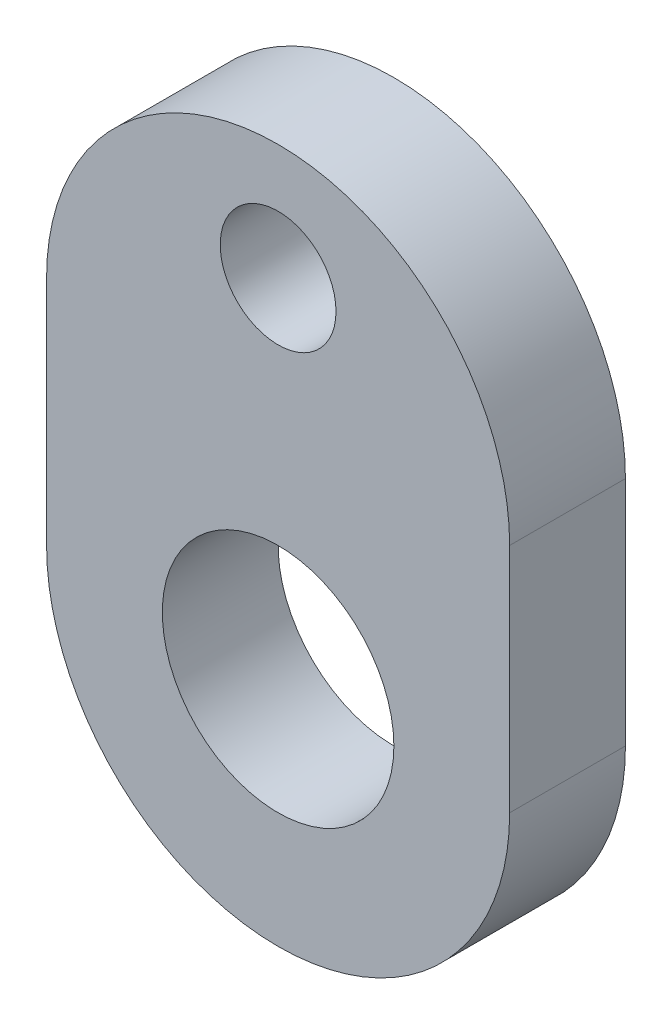
ISO-10303-21;
HEADER;
FILE_DESCRIPTION(('STEP AP214'),'2;1');
FILE_NAME('part.step','',(''),(''),'','','');
FILE_SCHEMA(('AUTOMOTIVE_DESIGN { 1 0 10303 214 1 1 1 1 }'));
ENDSEC;
DATA;
#1=APPLICATION_CONTEXT('core data for automotive mechanical design processes');
#2=APPLICATION_PROTOCOL_DEFINITION('international standard','automotive_design',2000,#1);
#3=PRODUCT_CONTEXT('',#1,'mechanical');
#4=PRODUCT('Part','Part','',(#3));
#5=PRODUCT_RELATED_PRODUCT_CATEGORY('part','',(#4));
#6=PRODUCT_DEFINITION_FORMATION('','',#4);
#7=PRODUCT_DEFINITION_CONTEXT('part definition',#1,'design');
#8=PRODUCT_DEFINITION('design','',#6,#7);
#9=PRODUCT_DEFINITION_SHAPE('','',#8);
#10=(LENGTH_UNIT() NAMED_UNIT(*) SI_UNIT(.MILLI.,.METRE.));
#11=(NAMED_UNIT(*) PLANE_ANGLE_UNIT() SI_UNIT($,.RADIAN.));
#12=(NAMED_UNIT(*) SI_UNIT($,.STERADIAN.) SOLID_ANGLE_UNIT());
#13=UNCERTAINTY_MEASURE_WITH_UNIT(LENGTH_MEASURE(1.E-05),#10,'distance_accuracy_value','');
#14=(GEOMETRIC_REPRESENTATION_CONTEXT(3) GLOBAL_UNCERTAINTY_ASSIGNED_CONTEXT((#13)) GLOBAL_UNIT_ASSIGNED_CONTEXT((#10,
#11,#12)) REPRESENTATION_CONTEXT('',''));
#15=CARTESIAN_POINT('',(0.,0.,0.));
#16=DIRECTION('',(0.,0.,1.));
#17=DIRECTION('',(1.,0.,0.));
#18=AXIS2_PLACEMENT_3D('',#15,#16,#17);
#19=CARTESIAN_POINT('',(0.,0.,6.35));
#20=DIRECTION('',(0.,0.,1.));
#21=DIRECTION('',(1.,0.,0.));
#22=AXIS2_PLACEMENT_3D('',#19,#20,#21);
#23=PLANE('',#22);
#24=CARTESIAN_POINT('',(0.,0.,6.35));
#25=DIRECTION('',(0.,0.,1.));
#26=DIRECTION('',(1.,0.,0.));
#27=AXIS2_PLACEMENT_3D('',#24,#25,#26);
#28=CIRCLE('',#27,6.35);
#29=CARTESIAN_POINT('',(6.35,0.,6.35));
#30=VERTEX_POINT('',#29);
#31=EDGE_CURVE('E100',#30,#30,#28,.T.);
#32=ORIENTED_EDGE('',*,*,#31,.F.);
#33=EDGE_LOOP('',(#32));
#34=FACE_BOUND('',#33,.T.);
#35=CARTESIAN_POINT('',(0.,0.,6.35));
#36=DIRECTION('',(0.,0.,1.));
#37=DIRECTION('',(1.,0.,0.));
#38=AXIS2_PLACEMENT_3D('',#35,#36,#37);
#39=CIRCLE('',#38,12.7);
#40=CARTESIAN_POINT('',(-12.7,0.,6.35));
#41=VERTEX_POINT('',#40);
#42=CARTESIAN_POINT('',(12.7,0.,6.35));
#43=VERTEX_POINT('',#42);
#44=EDGE_CURVE('E85',#41,#43,#39,.T.);
#45=ORIENTED_EDGE('',*,*,#44,.T.);
#46=DIRECTION('',(0.,1.,0.));
#47=VECTOR('',#46,1.);
#48=CARTESIAN_POINT('',(12.7,0.,6.35));
#49=LINE('',#48,#47);
#50=CARTESIAN_POINT('',(12.7,12.7,6.35));
#51=VERTEX_POINT('',#50);
#52=EDGE_CURVE('E80',#43,#51,#49,.T.);
#53=ORIENTED_EDGE('',*,*,#52,.T.);
#54=CARTESIAN_POINT('',(0.,12.7,6.35));
#55=DIRECTION('',(0.,0.,1.));
#56=DIRECTION('',(-1.,0.,0.));
#57=AXIS2_PLACEMENT_3D('',#54,#55,#56);
#58=CIRCLE('',#57,12.7);
#59=CARTESIAN_POINT('',(-12.7,12.7,6.35));
#60=VERTEX_POINT('',#59);
#61=EDGE_CURVE('E83',#51,#60,#58,.T.);
#62=ORIENTED_EDGE('',*,*,#61,.T.);
#63=DIRECTION('',(0.,-1.,0.));
#64=VECTOR('',#63,1.);
#65=CARTESIAN_POINT('',(-12.7,0.,6.35));
#66=LINE('',#65,#64);
#67=EDGE_CURVE('E50',#60,#41,#66,.T.);
#68=ORIENTED_EDGE('',*,*,#67,.T.);
#69=EDGE_LOOP('',(#45,#53,#62,#68));
#70=FACE_BOUND('',#69,.T.);
#71=CARTESIAN_POINT('',(0.,19.05,6.35));
#72=DIRECTION('',(0.,0.,1.));
#73=DIRECTION('',(1.,0.,0.));
#74=AXIS2_PLACEMENT_3D('',#71,#72,#73);
#75=CIRCLE('',#74,3.175);
#76=CARTESIAN_POINT('',(3.175,19.05,6.35));
#77=VERTEX_POINT('',#76);
#78=EDGE_CURVE('E115',#77,#77,#75,.T.);
#79=ORIENTED_EDGE('',*,*,#78,.F.);
#80=EDGE_LOOP('',(#79));
#81=FACE_BOUND('',#80,.T.);
#82=ADVANCED_FACE('F33',(#34,#70,#81),#23,.T.);
#83=CARTESIAN_POINT('',(0.,0.,0.));
#84=DIRECTION('',(0.,0.,1.));
#85=DIRECTION('',(1.,0.,0.));
#86=AXIS2_PLACEMENT_3D('',#83,#84,#85);
#87=PLANE('',#86);
#88=CARTESIAN_POINT('',(0.,0.,0.));
#89=DIRECTION('',(0.,0.,1.));
#90=DIRECTION('',(1.,0.,0.));
#91=AXIS2_PLACEMENT_3D('',#88,#89,#90);
#92=CIRCLE('',#91,12.7);
#93=CARTESIAN_POINT('',(-12.7,0.,0.));
#94=VERTEX_POINT('',#93);
#95=CARTESIAN_POINT('',(12.7,0.,0.));
#96=VERTEX_POINT('',#95);
#97=EDGE_CURVE('E97',#94,#96,#92,.T.);
#98=ORIENTED_EDGE('',*,*,#97,.F.);
#99=DIRECTION('',(0.,-1.,0.));
#100=VECTOR('',#99,1.);
#101=CARTESIAN_POINT('',(-12.7,0.,0.));
#102=LINE('',#101,#100);
#103=CARTESIAN_POINT('',(-12.7,12.7,0.));
#104=VERTEX_POINT('',#103);
#105=EDGE_CURVE('E73',#104,#94,#102,.T.);
#106=ORIENTED_EDGE('',*,*,#105,.F.);
#107=CARTESIAN_POINT('',(0.,12.7,0.));
#108=DIRECTION('',(0.,0.,1.));
#109=DIRECTION('',(-1.,0.,0.));
#110=AXIS2_PLACEMENT_3D('',#107,#108,#109);
#111=CIRCLE('',#110,12.7);
#112=CARTESIAN_POINT('',(12.7,12.7,0.));
#113=VERTEX_POINT('',#112);
#114=EDGE_CURVE('E67',#113,#104,#111,.T.);
#115=ORIENTED_EDGE('',*,*,#114,.F.);
#116=DIRECTION('',(0.,1.,0.));
#117=VECTOR('',#116,1.);
#118=CARTESIAN_POINT('',(12.7,0.,0.));
#119=LINE('',#118,#117);
#120=EDGE_CURVE('E89',#96,#113,#119,.T.);
#121=ORIENTED_EDGE('',*,*,#120,.F.);
#122=EDGE_LOOP('',(#98,#106,#115,#121));
#123=FACE_BOUND('',#122,.T.);
#124=CARTESIAN_POINT('',(0.,0.,0.));
#125=DIRECTION('',(0.,0.,1.));
#126=DIRECTION('',(1.,0.,0.));
#127=AXIS2_PLACEMENT_3D('',#124,#125,#126);
#128=CIRCLE('',#127,6.35);
#129=CARTESIAN_POINT('',(6.35,0.,0.));
#130=VERTEX_POINT('',#129);
#131=EDGE_CURVE('E112',#130,#130,#128,.T.);
#132=ORIENTED_EDGE('',*,*,#131,.T.);
#133=EDGE_LOOP('',(#132));
#134=FACE_BOUND('',#133,.T.);
#135=CARTESIAN_POINT('',(0.,19.05,0.));
#136=DIRECTION('',(0.,0.,1.));
#137=DIRECTION('',(1.,0.,0.));
#138=AXIS2_PLACEMENT_3D('',#135,#136,#137);
#139=CIRCLE('',#138,3.175);
#140=CARTESIAN_POINT('',(3.175,19.05,0.));
#141=VERTEX_POINT('',#140);
#142=EDGE_CURVE('E118',#141,#141,#139,.T.);
#143=ORIENTED_EDGE('',*,*,#142,.T.);
#144=EDGE_LOOP('',(#143));
#145=FACE_BOUND('',#144,.T.);
#146=ADVANCED_FACE('F108',(#123,#134,#145),#87,.F.);
#147=CARTESIAN_POINT('',(0.,0.,6.35));
#148=DIRECTION('',(0.,0.,-1.));
#149=DIRECTION('',(-1.,0.,0.));
#150=AXIS2_PLACEMENT_3D('',#147,#148,#149);
#151=CYLINDRICAL_SURFACE('',#150,12.7);
#152=ORIENTED_EDGE('',*,*,#97,.T.);
#153=DIRECTION('',(0.,0.,-1.));
#154=VECTOR('',#153,1.);
#155=CARTESIAN_POINT('',(12.7,0.,6.35));
#156=LINE('',#155,#154);
#157=EDGE_CURVE('E11',#43,#96,#156,.T.);
#158=ORIENTED_EDGE('',*,*,#157,.F.);
#159=ORIENTED_EDGE('',*,*,#44,.F.);
#160=DIRECTION('',(0.,0.,-1.));
#161=VECTOR('',#160,1.);
#162=CARTESIAN_POINT('',(-12.7,0.,6.35));
#163=LINE('',#162,#161);
#164=EDGE_CURVE('E93',#41,#94,#163,.T.);
#165=ORIENTED_EDGE('',*,*,#164,.T.);
#166=EDGE_LOOP('',(#152,#158,#159,#165));
#167=FACE_BOUND('',#166,.T.);
#168=ADVANCED_FACE('F35',(#167),#151,.T.);
#169=CARTESIAN_POINT('',(12.7,0.,6.35));
#170=DIRECTION('',(-1.,0.,0.));
#171=DIRECTION('',(0.,0.,1.));
#172=AXIS2_PLACEMENT_3D('',#169,#170,#171);
#173=PLANE('',#172);
#174=ORIENTED_EDGE('',*,*,#120,.T.);
#175=DIRECTION('',(0.,0.,-1.));
#176=VECTOR('',#175,1.);
#177=CARTESIAN_POINT('',(12.7,12.7,6.35));
#178=LINE('',#177,#176);
#179=EDGE_CURVE('E42',#51,#113,#178,.T.);
#180=ORIENTED_EDGE('',*,*,#179,.F.);
#181=ORIENTED_EDGE('',*,*,#52,.F.);
#182=ORIENTED_EDGE('',*,*,#157,.T.);
#183=EDGE_LOOP('',(#174,#180,#181,#182));
#184=FACE_BOUND('',#183,.T.);
#185=ADVANCED_FACE('F88',(#184),#173,.F.);
#186=CARTESIAN_POINT('',(0.,12.7,6.35));
#187=DIRECTION('',(0.,0.,-1.));
#188=DIRECTION('',(-1.,0.,0.));
#189=AXIS2_PLACEMENT_3D('',#186,#187,#188);
#190=CYLINDRICAL_SURFACE('',#189,12.7);
#191=ORIENTED_EDGE('',*,*,#114,.T.);
#192=DIRECTION('',(0.,0.,-1.));
#193=VECTOR('',#192,1.);
#194=CARTESIAN_POINT('',(-12.7,12.7,6.35));
#195=LINE('',#194,#193);
#196=EDGE_CURVE('E90',#60,#104,#195,.T.);
#197=ORIENTED_EDGE('',*,*,#196,.F.);
#198=ORIENTED_EDGE('',*,*,#61,.F.);
#199=ORIENTED_EDGE('',*,*,#179,.T.);
#200=EDGE_LOOP('',(#191,#197,#198,#199));
#201=FACE_BOUND('',#200,.T.);
#202=ADVANCED_FACE('F91',(#201),#190,.T.);
#203=CARTESIAN_POINT('',(-12.7,0.,6.35));
#204=DIRECTION('',(1.,0.,0.));
#205=DIRECTION('',(0.,0.,-1.));
#206=AXIS2_PLACEMENT_3D('',#203,#204,#205);
#207=PLANE('',#206);
#208=ORIENTED_EDGE('',*,*,#105,.T.);
#209=ORIENTED_EDGE('',*,*,#164,.F.);
#210=ORIENTED_EDGE('',*,*,#67,.F.);
#211=ORIENTED_EDGE('',*,*,#196,.T.);
#212=EDGE_LOOP('',(#208,#209,#210,#211));
#213=FACE_BOUND('',#212,.T.);
#214=ADVANCED_FACE('F105',(#213),#207,.F.);
#215=CARTESIAN_POINT('',(0.,0.,6.35));
#216=DIRECTION('',(0.,0.,-1.));
#217=DIRECTION('',(-1.,0.,0.));
#218=AXIS2_PLACEMENT_3D('',#215,#216,#217);
#219=CYLINDRICAL_SURFACE('',#218,6.35);
#220=ORIENTED_EDGE('',*,*,#31,.T.);
#221=EDGE_LOOP('',(#220));
#222=FACE_BOUND('',#221,.T.);
#223=ORIENTED_EDGE('',*,*,#131,.F.);
#224=EDGE_LOOP('',(#223));
#225=FACE_BOUND('',#224,.T.);
#226=ADVANCED_FACE('F135',(#222,#225),#219,.F.);
#227=CARTESIAN_POINT('',(0.,19.05,6.35));
#228=DIRECTION('',(0.,0.,-1.));
#229=DIRECTION('',(-1.,0.,0.));
#230=AXIS2_PLACEMENT_3D('',#227,#228,#229);
#231=CYLINDRICAL_SURFACE('',#230,3.175);
#232=ORIENTED_EDGE('',*,*,#78,.T.);
#233=EDGE_LOOP('',(#232));
#234=FACE_BOUND('',#233,.T.);
#235=ORIENTED_EDGE('',*,*,#142,.F.);
#236=EDGE_LOOP('',(#235));
#237=FACE_BOUND('',#236,.T.);
#238=ADVANCED_FACE('F124',(#234,#237),#231,.F.);
#239=CLOSED_SHELL('',(#82,#146,#168,#185,#202,#214,#226,#238));
#240=MANIFOLD_SOLID_BREP('B2',#239);
#241=ADVANCED_BREP_SHAPE_REPRESENTATION('',(#18,#240),#14);
#242=SHAPE_DEFINITION_REPRESENTATION(#9,#241);
ENDSEC;
END-ISO-10303-21;
